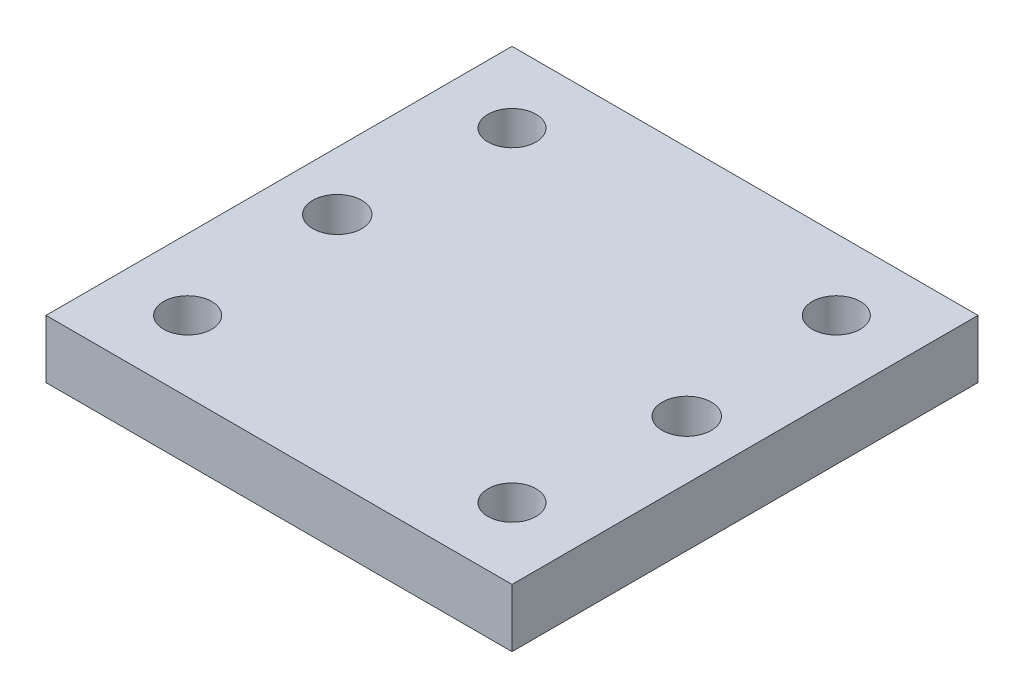
ISO-10303-21;
HEADER;
FILE_DESCRIPTION(('STEP AP214'),'2;1');
FILE_NAME('part.step','',(''),(''),'','','');
FILE_SCHEMA(('AUTOMOTIVE_DESIGN { 1 0 10303 214 1 1 1 1 }'));
ENDSEC;
DATA;
#1=APPLICATION_CONTEXT('core data for automotive mechanical design processes');
#2=APPLICATION_PROTOCOL_DEFINITION('international standard','automotive_design',2000,#1);
#3=PRODUCT_CONTEXT('',#1,'mechanical');
#4=PRODUCT('Part','Part','',(#3));
#5=PRODUCT_RELATED_PRODUCT_CATEGORY('part','',(#4));
#6=PRODUCT_DEFINITION_FORMATION('','',#4);
#7=PRODUCT_DEFINITION_CONTEXT('part definition',#1,'design');
#8=PRODUCT_DEFINITION('design','',#6,#7);
#9=PRODUCT_DEFINITION_SHAPE('','',#8);
#10=(LENGTH_UNIT() NAMED_UNIT(*) SI_UNIT(.MILLI.,.METRE.));
#11=(NAMED_UNIT(*) PLANE_ANGLE_UNIT() SI_UNIT($,.RADIAN.));
#12=(NAMED_UNIT(*) SI_UNIT($,.STERADIAN.) SOLID_ANGLE_UNIT());
#13=UNCERTAINTY_MEASURE_WITH_UNIT(LENGTH_MEASURE(1.E-05),#10,'distance_accuracy_value','');
#14=(GEOMETRIC_REPRESENTATION_CONTEXT(3) GLOBAL_UNCERTAINTY_ASSIGNED_CONTEXT((#13)) GLOBAL_UNIT_ASSIGNED_CONTEXT((#10,
#11,#12)) REPRESENTATION_CONTEXT('',''));
#15=CARTESIAN_POINT('',(0.,0.,0.));
#16=DIRECTION('',(0.,0.,1.));
#17=DIRECTION('',(1.,0.,0.));
#18=AXIS2_PLACEMENT_3D('',#15,#16,#17);
#19=CARTESIAN_POINT('',(0.,12.7,0.));
#20=DIRECTION('',(0.,-1.,0.));
#21=DIRECTION('',(0.,0.,-1.));
#22=AXIS2_PLACEMENT_3D('',#19,#20,#21);
#23=PLANE('',#22);
#24=CARTESIAN_POINT('',(88.9,12.7,-50.8));
#25=DIRECTION('',(0.,1.,0.));
#26=DIRECTION('',(0.,0.,1.));
#27=AXIS2_PLACEMENT_3D('',#24,#25,#26);
#28=CIRCLE('',#27,5.35813);
#29=CARTESIAN_POINT('',(88.9,12.7,-45.44187));
#30=VERTEX_POINT('',#29);
#31=EDGE_CURVE('E148',#30,#30,#28,.T.);
#32=ORIENTED_EDGE('',*,*,#31,.F.);
#33=EDGE_LOOP('',(#32));
#34=FACE_BOUND('',#33,.T.);
#35=CARTESIAN_POINT('',(12.7,12.7,-50.8));
#36=DIRECTION('',(0.,1.,0.));
#37=DIRECTION('',(0.,0.,1.));
#38=AXIS2_PLACEMENT_3D('',#35,#36,#37);
#39=CIRCLE('',#38,5.35813);
#40=CARTESIAN_POINT('',(12.7,12.7,-45.44187));
#41=VERTEX_POINT('',#40);
#42=EDGE_CURVE('E142',#41,#41,#39,.T.);
#43=ORIENTED_EDGE('',*,*,#42,.F.);
#44=EDGE_LOOP('',(#43));
#45=FACE_BOUND('',#44,.T.);
#46=CARTESIAN_POINT('',(86.1553390593273,12.7,-86.1553390593274));
#47=DIRECTION('',(0.,1.,0.));
#48=DIRECTION('',(0.,0.,1.));
#49=AXIS2_PLACEMENT_3D('',#46,#47,#48);
#50=CIRCLE('',#49,5.24999999999991);
#51=CARTESIAN_POINT('',(86.1553390593273,12.7,-80.9053390593275));
#52=VERTEX_POINT('',#51);
#53=EDGE_CURVE('E136',#52,#52,#50,.T.);
#54=ORIENTED_EDGE('',*,*,#53,.F.);
#55=EDGE_LOOP('',(#54));
#56=FACE_BOUND('',#55,.T.);
#57=CARTESIAN_POINT('',(86.1553390593272,12.7,-15.4446609406726));
#58=DIRECTION('',(0.,1.,0.));
#59=DIRECTION('',(0.,0.,1.));
#60=AXIS2_PLACEMENT_3D('',#57,#58,#59);
#61=CIRCLE('',#60,5.24999999999991);
#62=CARTESIAN_POINT('',(86.1553390593272,12.7,-10.1946609406726));
#63=VERTEX_POINT('',#62);
#64=EDGE_CURVE('E130',#63,#63,#61,.T.);
#65=ORIENTED_EDGE('',*,*,#64,.F.);
#66=EDGE_LOOP('',(#65));
#67=FACE_BOUND('',#66,.T.);
#68=CARTESIAN_POINT('',(15.4446609406727,12.7,-15.4446609406726));
#69=DIRECTION('',(0.,1.,0.));
#70=DIRECTION('',(0.,0.,1.));
#71=AXIS2_PLACEMENT_3D('',#68,#69,#70);
#72=CIRCLE('',#71,5.24999999999991);
#73=CARTESIAN_POINT('',(15.4446609406727,12.7,-10.1946609406727));
#74=VERTEX_POINT('',#73);
#75=EDGE_CURVE('E118',#74,#74,#72,.T.);
#76=ORIENTED_EDGE('',*,*,#75,.F.);
#77=EDGE_LOOP('',(#76));
#78=FACE_BOUND('',#77,.T.);
#79=DIRECTION('',(0.,0.,1.));
#80=VECTOR('',#79,1.);
#81=CARTESIAN_POINT('',(0.,12.7,0.));
#82=LINE('',#81,#80);
#83=CARTESIAN_POINT('',(0.,12.7,-101.6));
#84=VERTEX_POINT('',#83);
#85=CARTESIAN_POINT('',(0.,12.7,0.));
#86=VERTEX_POINT('',#85);
#87=EDGE_CURVE('E89',#84,#86,#82,.T.);
#88=ORIENTED_EDGE('',*,*,#87,.T.);
#89=DIRECTION('',(1.,0.,0.));
#90=VECTOR('',#89,1.);
#91=CARTESIAN_POINT('',(0.,12.7,0.));
#92=LINE('',#91,#90);
#93=CARTESIAN_POINT('',(101.6,12.7,0.));
#94=VERTEX_POINT('',#93);
#95=EDGE_CURVE('E84',#86,#94,#92,.T.);
#96=ORIENTED_EDGE('',*,*,#95,.T.);
#97=DIRECTION('',(0.,0.,-1.));
#98=VECTOR('',#97,1.);
#99=CARTESIAN_POINT('',(101.6,12.7,0.));
#100=LINE('',#99,#98);
#101=CARTESIAN_POINT('',(101.6,12.7,-101.6));
#102=VERTEX_POINT('',#101);
#103=EDGE_CURVE('E87',#94,#102,#100,.T.);
#104=ORIENTED_EDGE('',*,*,#103,.T.);
#105=DIRECTION('',(-1.,0.,0.));
#106=VECTOR('',#105,1.);
#107=CARTESIAN_POINT('',(0.,12.7,-101.6));
#108=LINE('',#107,#106);
#109=EDGE_CURVE('E54',#102,#84,#108,.T.);
#110=ORIENTED_EDGE('',*,*,#109,.T.);
#111=EDGE_LOOP('',(#88,#96,#104,#110));
#112=FACE_BOUND('',#111,.T.);
#113=CARTESIAN_POINT('',(15.4446609406727,12.7,-86.1553390593274));
#114=DIRECTION('',(0.,1.,0.));
#115=DIRECTION('',(0.,0.,1.));
#116=AXIS2_PLACEMENT_3D('',#113,#114,#115);
#117=CIRCLE('',#116,5.24999999999991);
#118=CARTESIAN_POINT('',(15.4446609406727,12.7,-80.9053390593275));
#119=VERTEX_POINT('',#118);
#120=EDGE_CURVE('E124',#119,#119,#117,.T.);
#121=ORIENTED_EDGE('',*,*,#120,.F.);
#122=EDGE_LOOP('',(#121));
#123=FACE_BOUND('',#122,.T.);
#124=ADVANCED_FACE('F37',(#34,#45,#56,#67,#78,#112,#123),#23,.F.);
#125=CARTESIAN_POINT('',(0.,0.,0.));
#126=DIRECTION('',(0.,-1.,0.));
#127=DIRECTION('',(0.,0.,-1.));
#128=AXIS2_PLACEMENT_3D('',#125,#126,#127);
#129=PLANE('',#128);
#130=CARTESIAN_POINT('',(88.9,0.,-50.8));
#131=DIRECTION('',(0.,1.,0.));
#132=DIRECTION('',(0.,0.,1.));
#133=AXIS2_PLACEMENT_3D('',#130,#131,#132);
#134=CIRCLE('',#133,5.35813);
#135=CARTESIAN_POINT('',(88.9,0.,-45.44187));
#136=VERTEX_POINT('',#135);
#137=EDGE_CURVE('E145',#136,#136,#134,.T.);
#138=ORIENTED_EDGE('',*,*,#137,.T.);
#139=EDGE_LOOP('',(#138));
#140=FACE_BOUND('',#139,.T.);
#141=CARTESIAN_POINT('',(12.7,0.,-50.8));
#142=DIRECTION('',(0.,1.,0.));
#143=DIRECTION('',(0.,0.,1.));
#144=AXIS2_PLACEMENT_3D('',#141,#142,#143);
#145=CIRCLE('',#144,5.35813);
#146=CARTESIAN_POINT('',(12.7,0.,-45.44187));
#147=VERTEX_POINT('',#146);
#148=EDGE_CURVE('E139',#147,#147,#145,.T.);
#149=ORIENTED_EDGE('',*,*,#148,.T.);
#150=EDGE_LOOP('',(#149));
#151=FACE_BOUND('',#150,.T.);
#152=CARTESIAN_POINT('',(86.1553390593273,0.,-86.1553390593274));
#153=DIRECTION('',(0.,1.,0.));
#154=DIRECTION('',(0.,0.,1.));
#155=AXIS2_PLACEMENT_3D('',#152,#153,#154);
#156=CIRCLE('',#155,5.24999999999991);
#157=CARTESIAN_POINT('',(86.1553390593273,0.,-80.9053390593275));
#158=VERTEX_POINT('',#157);
#159=EDGE_CURVE('E133',#158,#158,#156,.T.);
#160=ORIENTED_EDGE('',*,*,#159,.T.);
#161=EDGE_LOOP('',(#160));
#162=FACE_BOUND('',#161,.T.);
#163=CARTESIAN_POINT('',(86.1553390593272,0.,-15.4446609406726));
#164=DIRECTION('',(0.,1.,0.));
#165=DIRECTION('',(0.,0.,1.));
#166=AXIS2_PLACEMENT_3D('',#163,#164,#165);
#167=CIRCLE('',#166,5.24999999999991);
#168=CARTESIAN_POINT('',(86.1553390593272,0.,-10.1946609406726));
#169=VERTEX_POINT('',#168);
#170=EDGE_CURVE('E127',#169,#169,#167,.T.);
#171=ORIENTED_EDGE('',*,*,#170,.T.);
#172=EDGE_LOOP('',(#171));
#173=FACE_BOUND('',#172,.T.);
#174=CARTESIAN_POINT('',(15.4446609406727,0.,-86.1553390593274));
#175=DIRECTION('',(0.,1.,0.));
#176=DIRECTION('',(0.,0.,1.));
#177=AXIS2_PLACEMENT_3D('',#174,#175,#176);
#178=CIRCLE('',#177,5.24999999999991);
#179=CARTESIAN_POINT('',(15.4446609406727,0.,-80.9053390593275));
#180=VERTEX_POINT('',#179);
#181=EDGE_CURVE('E121',#180,#180,#178,.T.);
#182=ORIENTED_EDGE('',*,*,#181,.T.);
#183=EDGE_LOOP('',(#182));
#184=FACE_BOUND('',#183,.T.);
#185=DIRECTION('',(0.,0.,1.));
#186=VECTOR('',#185,1.);
#187=CARTESIAN_POINT('',(0.,0.,0.));
#188=LINE('',#187,#186);
#189=CARTESIAN_POINT('',(0.,0.,-101.6));
#190=VERTEX_POINT('',#189);
#191=CARTESIAN_POINT('',(0.,0.,0.));
#192=VERTEX_POINT('',#191);
#193=EDGE_CURVE('E101',#190,#192,#188,.T.);
#194=ORIENTED_EDGE('',*,*,#193,.F.);
#195=DIRECTION('',(-1.,0.,0.));
#196=VECTOR('',#195,1.);
#197=CARTESIAN_POINT('',(0.,0.,-101.6));
#198=LINE('',#197,#196);
#199=CARTESIAN_POINT('',(101.6,0.,-101.6));
#200=VERTEX_POINT('',#199);
#201=EDGE_CURVE('E77',#200,#190,#198,.T.);
#202=ORIENTED_EDGE('',*,*,#201,.F.);
#203=DIRECTION('',(0.,0.,-1.));
#204=VECTOR('',#203,1.);
#205=CARTESIAN_POINT('',(101.6,0.,0.));
#206=LINE('',#205,#204);
#207=CARTESIAN_POINT('',(101.6,0.,0.));
#208=VERTEX_POINT('',#207);
#209=EDGE_CURVE('E71',#208,#200,#206,.T.);
#210=ORIENTED_EDGE('',*,*,#209,.F.);
#211=DIRECTION('',(1.,0.,0.));
#212=VECTOR('',#211,1.);
#213=CARTESIAN_POINT('',(0.,0.,0.));
#214=LINE('',#213,#212);
#215=EDGE_CURVE('E93',#192,#208,#214,.T.);
#216=ORIENTED_EDGE('',*,*,#215,.F.);
#217=EDGE_LOOP('',(#194,#202,#210,#216));
#218=FACE_BOUND('',#217,.T.);
#219=CARTESIAN_POINT('',(15.4446609406727,0.,-15.4446609406726));
#220=DIRECTION('',(0.,1.,0.));
#221=DIRECTION('',(0.,0.,1.));
#222=AXIS2_PLACEMENT_3D('',#219,#220,#221);
#223=CIRCLE('',#222,5.24999999999991);
#224=CARTESIAN_POINT('',(15.4446609406727,0.,-10.1946609406727));
#225=VERTEX_POINT('',#224);
#226=EDGE_CURVE('E104',#225,#225,#223,.T.);
#227=ORIENTED_EDGE('',*,*,#226,.T.);
#228=EDGE_LOOP('',(#227));
#229=FACE_BOUND('',#228,.T.);
#230=ADVANCED_FACE('F112',(#140,#151,#162,#173,#184,#218,#229),#129,.T.);
#231=CARTESIAN_POINT('',(0.,12.7,0.));
#232=DIRECTION('',(1.,0.,0.));
#233=DIRECTION('',(0.,0.,-1.));
#234=AXIS2_PLACEMENT_3D('',#231,#232,#233);
#235=PLANE('',#234);
#236=ORIENTED_EDGE('',*,*,#193,.T.);
#237=DIRECTION('',(0.,-1.,0.));
#238=VECTOR('',#237,1.);
#239=CARTESIAN_POINT('',(0.,12.7,0.));
#240=LINE('',#239,#238);
#241=EDGE_CURVE('E11',#86,#192,#240,.T.);
#242=ORIENTED_EDGE('',*,*,#241,.F.);
#243=ORIENTED_EDGE('',*,*,#87,.F.);
#244=DIRECTION('',(0.,-1.,0.));
#245=VECTOR('',#244,1.);
#246=CARTESIAN_POINT('',(0.,12.7,-101.6));
#247=LINE('',#246,#245);
#248=EDGE_CURVE('E97',#84,#190,#247,.T.);
#249=ORIENTED_EDGE('',*,*,#248,.T.);
#250=EDGE_LOOP('',(#236,#242,#243,#249));
#251=FACE_BOUND('',#250,.T.);
#252=ADVANCED_FACE('F39',(#251),#235,.F.);
#253=CARTESIAN_POINT('',(0.,12.7,0.));
#254=DIRECTION('',(0.,0.,-1.));
#255=DIRECTION('',(-1.,0.,0.));
#256=AXIS2_PLACEMENT_3D('',#253,#254,#255);
#257=PLANE('',#256);
#258=ORIENTED_EDGE('',*,*,#215,.T.);
#259=DIRECTION('',(0.,-1.,0.));
#260=VECTOR('',#259,1.);
#261=CARTESIAN_POINT('',(101.6,12.7,0.));
#262=LINE('',#261,#260);
#263=EDGE_CURVE('E46',#94,#208,#262,.T.);
#264=ORIENTED_EDGE('',*,*,#263,.F.);
#265=ORIENTED_EDGE('',*,*,#95,.F.);
#266=ORIENTED_EDGE('',*,*,#241,.T.);
#267=EDGE_LOOP('',(#258,#264,#265,#266));
#268=FACE_BOUND('',#267,.T.);
#269=ADVANCED_FACE('F92',(#268),#257,.F.);
#270=CARTESIAN_POINT('',(101.6,12.7,0.));
#271=DIRECTION('',(-1.,0.,0.));
#272=DIRECTION('',(0.,0.,1.));
#273=AXIS2_PLACEMENT_3D('',#270,#271,#272);
#274=PLANE('',#273);
#275=ORIENTED_EDGE('',*,*,#209,.T.);
#276=DIRECTION('',(0.,-1.,0.));
#277=VECTOR('',#276,1.);
#278=CARTESIAN_POINT('',(101.6,12.7,-101.6));
#279=LINE('',#278,#277);
#280=EDGE_CURVE('E94',#102,#200,#279,.T.);
#281=ORIENTED_EDGE('',*,*,#280,.F.);
#282=ORIENTED_EDGE('',*,*,#103,.F.);
#283=ORIENTED_EDGE('',*,*,#263,.T.);
#284=EDGE_LOOP('',(#275,#281,#282,#283));
#285=FACE_BOUND('',#284,.T.);
#286=ADVANCED_FACE('F95',(#285),#274,.F.);
#287=CARTESIAN_POINT('',(0.,12.7,-101.6));
#288=DIRECTION('',(0.,0.,1.));
#289=DIRECTION('',(1.,0.,0.));
#290=AXIS2_PLACEMENT_3D('',#287,#288,#289);
#291=PLANE('',#290);
#292=ORIENTED_EDGE('',*,*,#201,.T.);
#293=ORIENTED_EDGE('',*,*,#248,.F.);
#294=ORIENTED_EDGE('',*,*,#109,.F.);
#295=ORIENTED_EDGE('',*,*,#280,.T.);
#296=EDGE_LOOP('',(#292,#293,#294,#295));
#297=FACE_BOUND('',#296,.T.);
#298=ADVANCED_FACE('F109',(#297),#291,.F.);
#299=CARTESIAN_POINT('',(15.4446609406727,12.7,-15.4446609406726));
#300=DIRECTION('',(0.,1.,0.));
#301=DIRECTION('',(0.,0.,1.));
#302=AXIS2_PLACEMENT_3D('',#299,#300,#301);
#303=CYLINDRICAL_SURFACE('',#302,5.24999999999991);
#304=ORIENTED_EDGE('',*,*,#226,.F.);
#305=EDGE_LOOP('',(#304));
#306=FACE_BOUND('',#305,.T.);
#307=ORIENTED_EDGE('',*,*,#75,.T.);
#308=EDGE_LOOP('',(#307));
#309=FACE_BOUND('',#308,.T.);
#310=ADVANCED_FACE('F165',(#306,#309),#303,.F.);
#311=CARTESIAN_POINT('',(15.4446609406727,12.7,-86.1553390593274));
#312=DIRECTION('',(0.,1.,0.));
#313=DIRECTION('',(0.,0.,1.));
#314=AXIS2_PLACEMENT_3D('',#311,#312,#313);
#315=CYLINDRICAL_SURFACE('',#314,5.24999999999991);
#316=ORIENTED_EDGE('',*,*,#181,.F.);
#317=EDGE_LOOP('',(#316));
#318=FACE_BOUND('',#317,.T.);
#319=ORIENTED_EDGE('',*,*,#120,.T.);
#320=EDGE_LOOP('',(#319));
#321=FACE_BOUND('',#320,.T.);
#322=ADVANCED_FACE('F167',(#318,#321),#315,.F.);
#323=CARTESIAN_POINT('',(86.1553390593272,12.7,-15.4446609406726));
#324=DIRECTION('',(0.,1.,0.));
#325=DIRECTION('',(0.,0.,1.));
#326=AXIS2_PLACEMENT_3D('',#323,#324,#325);
#327=CYLINDRICAL_SURFACE('',#326,5.24999999999991);
#328=ORIENTED_EDGE('',*,*,#170,.F.);
#329=EDGE_LOOP('',(#328));
#330=FACE_BOUND('',#329,.T.);
#331=ORIENTED_EDGE('',*,*,#64,.T.);
#332=EDGE_LOOP('',(#331));
#333=FACE_BOUND('',#332,.T.);
#334=ADVANCED_FACE('F174',(#330,#333),#327,.F.);
#335=CARTESIAN_POINT('',(86.1553390593273,12.7,-86.1553390593274));
#336=DIRECTION('',(0.,1.,0.));
#337=DIRECTION('',(0.,0.,1.));
#338=AXIS2_PLACEMENT_3D('',#335,#336,#337);
#339=CYLINDRICAL_SURFACE('',#338,5.24999999999991);
#340=ORIENTED_EDGE('',*,*,#159,.F.);
#341=EDGE_LOOP('',(#340));
#342=FACE_BOUND('',#341,.T.);
#343=ORIENTED_EDGE('',*,*,#53,.T.);
#344=EDGE_LOOP('',(#343));
#345=FACE_BOUND('',#344,.T.);
#346=ADVANCED_FACE('F209',(#342,#345),#339,.F.);
#347=CARTESIAN_POINT('',(12.7,12.7,-50.8));
#348=DIRECTION('',(0.,1.,0.));
#349=DIRECTION('',(0.,0.,1.));
#350=AXIS2_PLACEMENT_3D('',#347,#348,#349);
#351=CYLINDRICAL_SURFACE('',#350,5.35813);
#352=ORIENTED_EDGE('',*,*,#148,.F.);
#353=EDGE_LOOP('',(#352));
#354=FACE_BOUND('',#353,.T.);
#355=ORIENTED_EDGE('',*,*,#42,.T.);
#356=EDGE_LOOP('',(#355));
#357=FACE_BOUND('',#356,.T.);
#358=ADVANCED_FACE('F214',(#354,#357),#351,.F.);
#359=CARTESIAN_POINT('',(88.9,12.7,-50.8));
#360=DIRECTION('',(0.,1.,0.));
#361=DIRECTION('',(0.,0.,1.));
#362=AXIS2_PLACEMENT_3D('',#359,#360,#361);
#363=CYLINDRICAL_SURFACE('',#362,5.35813);
#364=ORIENTED_EDGE('',*,*,#137,.F.);
#365=EDGE_LOOP('',(#364));
#366=FACE_BOUND('',#365,.T.);
#367=ORIENTED_EDGE('',*,*,#31,.T.);
#368=EDGE_LOOP('',(#367));
#369=FACE_BOUND('',#368,.T.);
#370=ADVANCED_FACE('F152',(#366,#369),#363,.F.);
#371=CLOSED_SHELL('',(#124,#230,#252,#269,#286,#298,#310,#322,#334,#346,#358,#370));
#372=MANIFOLD_SOLID_BREP('B2',#371);
#373=ADVANCED_BREP_SHAPE_REPRESENTATION('',(#18,#372),#14);
#374=SHAPE_DEFINITION_REPRESENTATION(#9,#373);
ENDSEC;
END-ISO-10303-21;
